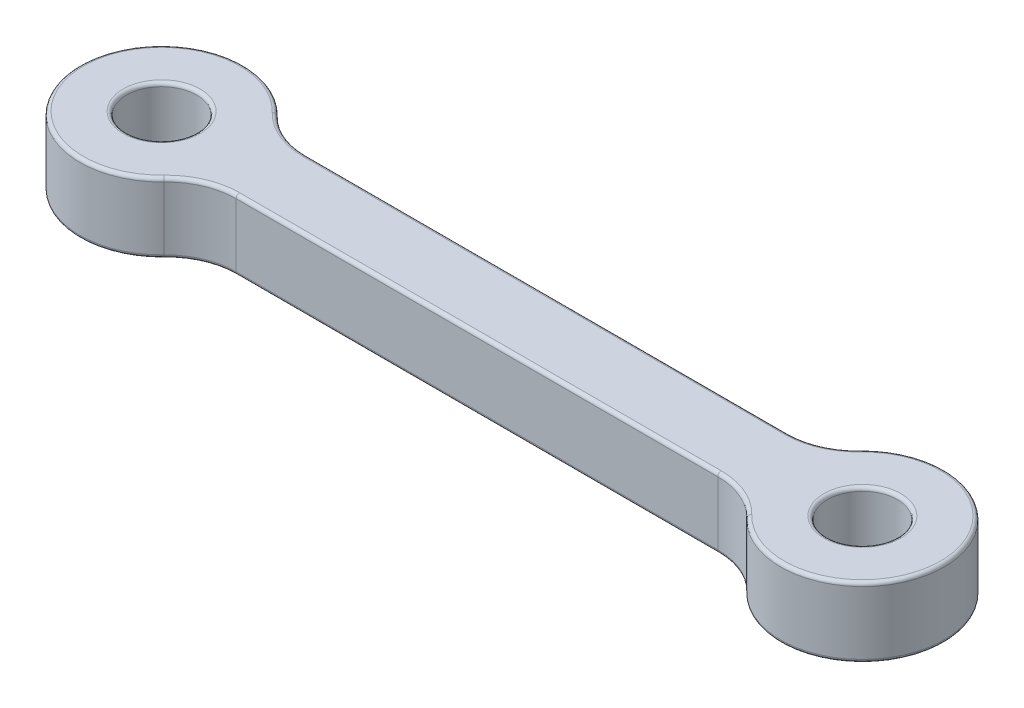
ISO-10303-21;
HEADER;
FILE_DESCRIPTION(('STEP AP214'),'2;1');
FILE_NAME('part.step','',(''),(''),'','','');
FILE_SCHEMA(('AUTOMOTIVE_DESIGN { 1 0 10303 214 1 1 1 1 }'));
ENDSEC;
DATA;
#1=APPLICATION_CONTEXT('core data for automotive mechanical design processes');
#2=APPLICATION_PROTOCOL_DEFINITION('international standard','automotive_design',2000,#1);
#3=PRODUCT_CONTEXT('',#1,'mechanical');
#4=PRODUCT('Part','Part','',(#3));
#5=PRODUCT_RELATED_PRODUCT_CATEGORY('part','',(#4));
#6=PRODUCT_DEFINITION_FORMATION('','',#4);
#7=PRODUCT_DEFINITION_CONTEXT('part definition',#1,'design');
#8=PRODUCT_DEFINITION('design','',#6,#7);
#9=PRODUCT_DEFINITION_SHAPE('','',#8);
#10=(LENGTH_UNIT() NAMED_UNIT(*) SI_UNIT(.MILLI.,.METRE.));
#11=(NAMED_UNIT(*) PLANE_ANGLE_UNIT() SI_UNIT($,.RADIAN.));
#12=(NAMED_UNIT(*) SI_UNIT($,.STERADIAN.) SOLID_ANGLE_UNIT());
#13=UNCERTAINTY_MEASURE_WITH_UNIT(LENGTH_MEASURE(1.E-05),#10,'distance_accuracy_value','');
#14=(GEOMETRIC_REPRESENTATION_CONTEXT(3) GLOBAL_UNCERTAINTY_ASSIGNED_CONTEXT((#13)) GLOBAL_UNIT_ASSIGNED_CONTEXT((#10,
#11,#12)) REPRESENTATION_CONTEXT('',''));
#15=CARTESIAN_POINT('',(0.,0.,0.));
#16=DIRECTION('',(0.,0.,1.));
#17=DIRECTION('',(1.,0.,0.));
#18=AXIS2_PLACEMENT_3D('',#15,#16,#17);
#19=CARTESIAN_POINT('',(-15.,3.,0.));
#20=DIRECTION('',(0.,1.,0.));
#21=DIRECTION('',(0.,0.,1.));
#22=AXIS2_PLACEMENT_3D('',#19,#20,#21);
#23=PLANE('',#22);
#24=CARTESIAN_POINT('',(15.,3.,-1.11022302462516E-13));
#25=DIRECTION('',(0.,1.,0.));
#26=DIRECTION('',(0.,0.,1.));
#27=AXIS2_PLACEMENT_3D('',#24,#25,#26);
#28=CIRCLE('',#27,1.65);
#29=CARTESIAN_POINT('',(15.,3.,1.64999999999989));
#30=VERTEX_POINT('',#29);
#31=EDGE_CURVE('E290',#30,#30,#28,.F.);
#32=ORIENTED_EDGE('',*,*,#31,.T.);
#33=EDGE_LOOP('',(#32));
#34=FACE_BOUND('',#33,.T.);
#35=CARTESIAN_POINT('',(15.,3.,-1.11022302462516E-13));
#36=DIRECTION('',(0.,1.,0.));
#37=DIRECTION('',(0.,0.,1.));
#38=AXIS2_PLACEMENT_3D('',#35,#36,#37);
#39=CIRCLE('',#38,3.35);
#40=CARTESIAN_POINT('',(12.5826318776295,3.,2.31923076923069));
#41=VERTEX_POINT('',#40);
#42=CARTESIAN_POINT('',(12.5826318776294,3.,-2.31923076923085));
#43=VERTEX_POINT('',#42);
#44=EDGE_CURVE('E57',#41,#43,#39,.T.);
#45=ORIENTED_EDGE('',*,*,#44,.T.);
#46=CARTESIAN_POINT('',(10.3095842401765,3.,-4.50000000000005));
#47=DIRECTION('',(0.,1.,0.));
#48=DIRECTION('',(0.,0.,1.));
#49=AXIS2_PLACEMENT_3D('',#46,#47,#48);
#50=CIRCLE('',#49,3.15);
#51=CARTESIAN_POINT('',(10.3095842401765,3.,-1.35000000000005));
#52=VERTEX_POINT('',#51);
#53=EDGE_CURVE('E287',#43,#52,#50,.F.);
#54=ORIENTED_EDGE('',*,*,#53,.T.);
#55=DIRECTION('',(-1.,0.,0.));
#56=VECTOR('',#55,1.);
#57=CARTESIAN_POINT('',(-10.3095842401766,3.,-1.35));
#58=LINE('',#57,#56);
#59=CARTESIAN_POINT('',(-10.3095842401766,3.,-1.35));
#60=VERTEX_POINT('',#59);
#61=EDGE_CURVE('E268',#52,#60,#58,.T.);
#62=ORIENTED_EDGE('',*,*,#61,.T.);
#63=CARTESIAN_POINT('',(-10.3095842401766,3.,-4.5));
#64=DIRECTION('',(0.,1.,0.));
#65=DIRECTION('',(0.,0.,1.));
#66=AXIS2_PLACEMENT_3D('',#63,#64,#65);
#67=CIRCLE('',#66,3.15);
#68=CARTESIAN_POINT('',(-12.5826318776295,3.,-2.31923076923077));
#69=VERTEX_POINT('',#68);
#70=EDGE_CURVE('E271',#60,#69,#67,.F.);
#71=ORIENTED_EDGE('',*,*,#70,.T.);
#72=CARTESIAN_POINT('',(-15.,3.,0.));
#73=DIRECTION('',(0.,1.,0.));
#74=DIRECTION('',(0.,0.,1.));
#75=AXIS2_PLACEMENT_3D('',#72,#73,#74);
#76=CIRCLE('',#75,3.35);
#77=CARTESIAN_POINT('',(-12.5826318776295,3.,2.31923076923077));
#78=VERTEX_POINT('',#77);
#79=EDGE_CURVE('E274',#69,#78,#76,.T.);
#80=ORIENTED_EDGE('',*,*,#79,.T.);
#81=CARTESIAN_POINT('',(-10.3095842401766,3.,4.5));
#82=DIRECTION('',(0.,1.,0.));
#83=DIRECTION('',(0.,0.,1.));
#84=AXIS2_PLACEMENT_3D('',#81,#82,#83);
#85=CIRCLE('',#84,3.15);
#86=CARTESIAN_POINT('',(-10.3095842401766,3.,1.35));
#87=VERTEX_POINT('',#86);
#88=EDGE_CURVE('E277',#78,#87,#85,.F.);
#89=ORIENTED_EDGE('',*,*,#88,.T.);
#90=DIRECTION('',(1.,0.,0.));
#91=VECTOR('',#90,1.);
#92=CARTESIAN_POINT('',(10.3095842401766,3.,1.34999999999995));
#93=LINE('',#92,#91);
#94=CARTESIAN_POINT('',(10.3095842401766,3.,1.34999999999995));
#95=VERTEX_POINT('',#94);
#96=EDGE_CURVE('E280',#87,#95,#93,.T.);
#97=ORIENTED_EDGE('',*,*,#96,.T.);
#98=CARTESIAN_POINT('',(10.3095842401766,3.,4.49999999999995));
#99=DIRECTION('',(0.,1.,0.));
#100=DIRECTION('',(0.,0.,1.));
#101=AXIS2_PLACEMENT_3D('',#98,#99,#100);
#102=CIRCLE('',#101,3.15);
#103=EDGE_CURVE('E62',#95,#41,#102,.F.);
#104=ORIENTED_EDGE('',*,*,#103,.T.);
#105=EDGE_LOOP('',(#45,#54,#62,#71,#80,#89,#97,#104));
#106=FACE_BOUND('',#105,.T.);
#107=CARTESIAN_POINT('',(-15.,3.,0.));
#108=DIRECTION('',(0.,1.,0.));
#109=DIRECTION('',(0.,0.,1.));
#110=AXIS2_PLACEMENT_3D('',#107,#108,#109);
#111=CIRCLE('',#110,1.65);
#112=CARTESIAN_POINT('',(-15.,3.,1.65));
#113=VERTEX_POINT('',#112);
#114=EDGE_CURVE('E264',#113,#113,#111,.F.);
#115=ORIENTED_EDGE('',*,*,#114,.T.);
#116=EDGE_LOOP('',(#115));
#117=FACE_BOUND('',#116,.T.);
#118=ADVANCED_FACE('F39',(#34,#106,#117),#23,.T.);
#119=CARTESIAN_POINT('',(-15.,0.,0.));
#120=DIRECTION('',(0.,1.,0.));
#121=DIRECTION('',(0.,0.,1.));
#122=AXIS2_PLACEMENT_3D('',#119,#120,#121);
#123=PLANE('',#122);
#124=CARTESIAN_POINT('',(15.,0.,-1.11022302462516E-13));
#125=DIRECTION('',(0.,1.,0.));
#126=DIRECTION('',(0.,0.,1.));
#127=AXIS2_PLACEMENT_3D('',#124,#125,#126);
#128=CIRCLE('',#127,1.65);
#129=CARTESIAN_POINT('',(15.,0.,1.64999999999989));
#130=VERTEX_POINT('',#129);
#131=EDGE_CURVE('E209',#130,#130,#128,.T.);
#132=ORIENTED_EDGE('',*,*,#131,.T.);
#133=EDGE_LOOP('',(#132));
#134=FACE_BOUND('',#133,.T.);
#135=DIRECTION('',(1.,0.,0.));
#136=VECTOR('',#135,1.);
#137=CARTESIAN_POINT('',(-15.,0.,1.35000000000001));
#138=LINE('',#137,#136);
#139=CARTESIAN_POINT('',(10.3095842401766,0.,1.34999999999995));
#140=VERTEX_POINT('',#139);
#141=CARTESIAN_POINT('',(-10.3095842401766,0.,1.35));
#142=VERTEX_POINT('',#141);
#143=EDGE_CURVE('E160',#140,#142,#138,.F.);
#144=ORIENTED_EDGE('',*,*,#143,.T.);
#145=CARTESIAN_POINT('',(-10.3095842401766,0.,4.5));
#146=DIRECTION('',(0.,1.,0.));
#147=DIRECTION('',(0.,0.,1.));
#148=AXIS2_PLACEMENT_3D('',#145,#146,#147);
#149=CIRCLE('',#148,3.15);
#150=CARTESIAN_POINT('',(-12.5826318776295,0.,2.31923076923077));
#151=VERTEX_POINT('',#150);
#152=EDGE_CURVE('E206',#142,#151,#149,.T.);
#153=ORIENTED_EDGE('',*,*,#152,.T.);
#154=CARTESIAN_POINT('',(-15.,0.,0.));
#155=DIRECTION('',(0.,1.,0.));
#156=DIRECTION('',(0.,0.,1.));
#157=AXIS2_PLACEMENT_3D('',#154,#155,#156);
#158=CIRCLE('',#157,3.35);
#159=CARTESIAN_POINT('',(-12.5826318776295,0.,-2.31923076923077));
#160=VERTEX_POINT('',#159);
#161=EDGE_CURVE('E203',#151,#160,#158,.F.);
#162=ORIENTED_EDGE('',*,*,#161,.T.);
#163=CARTESIAN_POINT('',(-10.3095842401766,0.,-4.5));
#164=DIRECTION('',(0.,1.,0.));
#165=DIRECTION('',(0.,0.,1.));
#166=AXIS2_PLACEMENT_3D('',#163,#164,#165);
#167=CIRCLE('',#166,3.15);
#168=CARTESIAN_POINT('',(-10.3095842401766,0.,-1.35));
#169=VERTEX_POINT('',#168);
#170=EDGE_CURVE('E200',#160,#169,#167,.T.);
#171=ORIENTED_EDGE('',*,*,#170,.T.);
#172=DIRECTION('',(-1.,0.,0.));
#173=VECTOR('',#172,1.);
#174=CARTESIAN_POINT('',(-15.,0.,-1.34999999999999));
#175=LINE('',#174,#173);
#176=CARTESIAN_POINT('',(10.3095842401765,0.,-1.35000000000005));
#177=VERTEX_POINT('',#176);
#178=EDGE_CURVE('E197',#169,#177,#175,.F.);
#179=ORIENTED_EDGE('',*,*,#178,.T.);
#180=CARTESIAN_POINT('',(10.3095842401765,0.,-4.50000000000005));
#181=DIRECTION('',(0.,1.,0.));
#182=DIRECTION('',(0.,0.,1.));
#183=AXIS2_PLACEMENT_3D('',#180,#181,#182);
#184=CIRCLE('',#183,3.15);
#185=CARTESIAN_POINT('',(12.5826318776294,0.,-2.31923076923085));
#186=VERTEX_POINT('',#185);
#187=EDGE_CURVE('E194',#177,#186,#184,.T.);
#188=ORIENTED_EDGE('',*,*,#187,.T.);
#189=CARTESIAN_POINT('',(15.,0.,-1.11022302462516E-13));
#190=DIRECTION('',(0.,1.,0.));
#191=DIRECTION('',(0.,0.,1.));
#192=AXIS2_PLACEMENT_3D('',#189,#190,#191);
#193=CIRCLE('',#192,3.35);
#194=CARTESIAN_POINT('',(12.5826318776295,0.,2.31923076923069));
#195=VERTEX_POINT('',#194);
#196=EDGE_CURVE('E163',#186,#195,#193,.F.);
#197=ORIENTED_EDGE('',*,*,#196,.T.);
#198=CARTESIAN_POINT('',(10.3095842401766,0.,4.49999999999995));
#199=DIRECTION('',(0.,1.,0.));
#200=DIRECTION('',(0.,0.,1.));
#201=AXIS2_PLACEMENT_3D('',#198,#199,#200);
#202=CIRCLE('',#201,3.15);
#203=EDGE_CURVE('E154',#195,#140,#202,.T.);
#204=ORIENTED_EDGE('',*,*,#203,.T.);
#205=EDGE_LOOP('',(#144,#153,#162,#171,#179,#188,#197,#204));
#206=FACE_BOUND('',#205,.T.);
#207=CARTESIAN_POINT('',(-15.,0.,0.));
#208=DIRECTION('',(0.,1.,0.));
#209=DIRECTION('',(0.,0.,1.));
#210=AXIS2_PLACEMENT_3D('',#207,#208,#209);
#211=CIRCLE('',#210,1.5);
#212=CARTESIAN_POINT('',(-15.,0.,1.5));
#213=VERTEX_POINT('',#212);
#214=EDGE_CURVE('E321',#213,#213,#211,.T.);
#215=ORIENTED_EDGE('',*,*,#214,.T.);
#216=EDGE_LOOP('',(#215));
#217=FACE_BOUND('',#216,.T.);
#218=ADVANCED_FACE('F156',(#134,#206,#217),#123,.F.);
#219=CARTESIAN_POINT('',(-15.,3.,0.));
#220=DIRECTION('',(0.,-1.,0.));
#221=DIRECTION('',(0.,0.,-1.));
#222=AXIS2_PLACEMENT_3D('',#219,#220,#221);
#223=CYLINDRICAL_SURFACE('',#222,3.5);
#224=DIRECTION('',(0.,-1.,0.));
#225=VECTOR('',#224,1.);
#226=CARTESIAN_POINT('',(-12.4743915139412,3.,-2.42307692307693));
#227=LINE('',#226,#225);
#228=CARTESIAN_POINT('',(-12.4743915139412,2.85,-2.42307692307693));
#229=VERTEX_POINT('',#228);
#230=CARTESIAN_POINT('',(-12.4743915139412,0.15,-2.42307692307693));
#231=VERTEX_POINT('',#230);
#232=EDGE_CURVE('E377',#229,#231,#227,.T.);
#233=ORIENTED_EDGE('',*,*,#232,.T.);
#234=CARTESIAN_POINT('',(-15.,0.15,0.));
#235=DIRECTION('',(0.,1.,0.));
#236=DIRECTION('',(0.,0.,1.));
#237=AXIS2_PLACEMENT_3D('',#234,#235,#236);
#238=CIRCLE('',#237,3.5);
#239=CARTESIAN_POINT('',(-12.4743915139412,0.15,2.42307692307692));
#240=VERTEX_POINT('',#239);
#241=EDGE_CURVE('E223',#231,#240,#238,.T.);
#242=ORIENTED_EDGE('',*,*,#241,.T.);
#243=DIRECTION('',(0.,-1.,0.));
#244=VECTOR('',#243,1.);
#245=CARTESIAN_POINT('',(-12.4743915139412,3.,2.42307692307692));
#246=LINE('',#245,#244);
#247=CARTESIAN_POINT('',(-12.4743915139412,2.85,2.42307692307692));
#248=VERTEX_POINT('',#247);
#249=EDGE_CURVE('E367',#240,#248,#246,.F.);
#250=ORIENTED_EDGE('',*,*,#249,.T.);
#251=CARTESIAN_POINT('',(-15.,2.85,0.));
#252=DIRECTION('',(0.,1.,0.));
#253=DIRECTION('',(0.,0.,1.));
#254=AXIS2_PLACEMENT_3D('',#251,#252,#253);
#255=CIRCLE('',#254,3.5);
#256=EDGE_CURVE('E220',#248,#229,#255,.F.);
#257=ORIENTED_EDGE('',*,*,#256,.T.);
#258=EDGE_LOOP('',(#233,#242,#250,#257));
#259=FACE_BOUND('',#258,.T.);
#260=ADVANCED_FACE('F373',(#259),#223,.T.);
#261=CARTESIAN_POINT('',(-11.8377223398316,3.,1.5));
#262=DIRECTION('',(0.,0.,-1.));
#263=DIRECTION('',(-1.,0.,0.));
#264=AXIS2_PLACEMENT_3D('',#261,#262,#263);
#265=PLANE('',#264);
#266=DIRECTION('',(0.,1.,0.));
#267=VECTOR('',#266,1.);
#268=CARTESIAN_POINT('',(10.3095842401766,3.,1.49999999999995));
#269=LINE('',#268,#267);
#270=CARTESIAN_POINT('',(10.3095842401766,0.15,1.49999999999995));
#271=VERTEX_POINT('',#270);
#272=CARTESIAN_POINT('',(10.3095842401766,2.85,1.49999999999995));
#273=VERTEX_POINT('',#272);
#274=EDGE_CURVE('E382',#271,#273,#269,.T.);
#275=ORIENTED_EDGE('',*,*,#274,.T.);
#276=DIRECTION('',(1.,0.,0.));
#277=VECTOR('',#276,1.);
#278=CARTESIAN_POINT('',(-10.3095842401766,2.85,1.5));
#279=LINE('',#278,#277);
#280=CARTESIAN_POINT('',(-10.3095842401766,2.85,1.5));
#281=VERTEX_POINT('',#280);
#282=EDGE_CURVE('E49',#273,#281,#279,.F.);
#283=ORIENTED_EDGE('',*,*,#282,.T.);
#284=DIRECTION('',(0.,1.,0.));
#285=VECTOR('',#284,1.);
#286=CARTESIAN_POINT('',(-10.3095842401766,0.,1.5));
#287=LINE('',#286,#285);
#288=CARTESIAN_POINT('',(-10.3095842401766,0.15,1.5));
#289=VERTEX_POINT('',#288);
#290=EDGE_CURVE('E370',#281,#289,#287,.F.);
#291=ORIENTED_EDGE('',*,*,#290,.T.);
#292=DIRECTION('',(1.,0.,0.));
#293=VECTOR('',#292,1.);
#294=CARTESIAN_POINT('',(-11.8377223398316,0.15,1.5));
#295=LINE('',#294,#293);
#296=EDGE_CURVE('E294',#289,#271,#295,.T.);
#297=ORIENTED_EDGE('',*,*,#296,.T.);
#298=EDGE_LOOP('',(#275,#283,#291,#297));
#299=FACE_BOUND('',#298,.T.);
#300=ADVANCED_FACE('F429',(#299),#265,.F.);
#301=CARTESIAN_POINT('',(15.,3.,-1.11022302462516E-13));
#302=DIRECTION('',(0.,-1.,0.));
#303=DIRECTION('',(0.,0.,-1.));
#304=AXIS2_PLACEMENT_3D('',#301,#302,#303);
#305=CYLINDRICAL_SURFACE('',#304,3.5);
#306=DIRECTION('',(0.,-1.,0.));
#307=VECTOR('',#306,1.);
#308=CARTESIAN_POINT('',(12.4743915139413,3.,2.42307692307684));
#309=LINE('',#308,#307);
#310=CARTESIAN_POINT('',(12.4743915139413,2.85,2.42307692307684));
#311=VERTEX_POINT('',#310);
#312=CARTESIAN_POINT('',(12.4743915139413,0.15,2.42307692307684));
#313=VERTEX_POINT('',#312);
#314=EDGE_CURVE('E390',#311,#313,#309,.T.);
#315=ORIENTED_EDGE('',*,*,#314,.T.);
#316=CARTESIAN_POINT('',(15.,0.15,-1.11022302462516E-13));
#317=DIRECTION('',(0.,1.,0.));
#318=DIRECTION('',(0.,0.,1.));
#319=AXIS2_PLACEMENT_3D('',#316,#317,#318);
#320=CIRCLE('',#319,3.5);
#321=CARTESIAN_POINT('',(12.4743915139412,0.15,-2.423076923077));
#322=VERTEX_POINT('',#321);
#323=EDGE_CURVE('E248',#313,#322,#320,.T.);
#324=ORIENTED_EDGE('',*,*,#323,.T.);
#325=DIRECTION('',(0.,-1.,0.));
#326=VECTOR('',#325,1.);
#327=CARTESIAN_POINT('',(12.4743915139412,3.,-2.423076923077));
#328=LINE('',#327,#326);
#329=CARTESIAN_POINT('',(12.4743915139412,2.85,-2.423076923077));
#330=VERTEX_POINT('',#329);
#331=EDGE_CURVE('E394',#322,#330,#328,.F.);
#332=ORIENTED_EDGE('',*,*,#331,.T.);
#333=CARTESIAN_POINT('',(15.,2.85,-1.11022302462516E-13));
#334=DIRECTION('',(0.,1.,0.));
#335=DIRECTION('',(0.,0.,1.));
#336=AXIS2_PLACEMENT_3D('',#333,#334,#335);
#337=CIRCLE('',#336,3.5);
#338=EDGE_CURVE('E245',#330,#311,#337,.F.);
#339=ORIENTED_EDGE('',*,*,#338,.T.);
#340=EDGE_LOOP('',(#315,#324,#332,#339));
#341=FACE_BOUND('',#340,.T.);
#342=ADVANCED_FACE('F415',(#341),#305,.T.);
#343=CARTESIAN_POINT('',(-11.8377223398316,3.,-1.5));
#344=DIRECTION('',(0.,0.,1.));
#345=DIRECTION('',(1.,0.,0.));
#346=AXIS2_PLACEMENT_3D('',#343,#344,#345);
#347=PLANE('',#346);
#348=DIRECTION('',(0.,1.,0.));
#349=VECTOR('',#348,1.);
#350=CARTESIAN_POINT('',(10.3095842401765,0.,-1.50000000000005));
#351=LINE('',#350,#349);
#352=CARTESIAN_POINT('',(10.3095842401765,2.85,-1.50000000000005));
#353=VERTEX_POINT('',#352);
#354=CARTESIAN_POINT('',(10.3095842401765,0.15,-1.50000000000005));
#355=VERTEX_POINT('',#354);
#356=EDGE_CURVE('E188',#353,#355,#351,.F.);
#357=ORIENTED_EDGE('',*,*,#356,.T.);
#358=DIRECTION('',(-1.,0.,0.));
#359=VECTOR('',#358,1.);
#360=CARTESIAN_POINT('',(-11.8377223398316,0.15,-1.5));
#361=LINE('',#360,#359);
#362=CARTESIAN_POINT('',(-10.3095842401766,0.15,-1.5));
#363=VERTEX_POINT('',#362);
#364=EDGE_CURVE('E235',#355,#363,#361,.T.);
#365=ORIENTED_EDGE('',*,*,#364,.T.);
#366=DIRECTION('',(0.,1.,0.));
#367=VECTOR('',#366,1.);
#368=CARTESIAN_POINT('',(-10.3095842401766,3.,-1.5));
#369=LINE('',#368,#367);
#370=CARTESIAN_POINT('',(-10.3095842401766,2.85,-1.5));
#371=VERTEX_POINT('',#370);
#372=EDGE_CURVE('E184',#363,#371,#369,.T.);
#373=ORIENTED_EDGE('',*,*,#372,.T.);
#374=DIRECTION('',(-1.,0.,0.));
#375=VECTOR('',#374,1.);
#376=CARTESIAN_POINT('',(10.3095842401765,2.85,-1.50000000000005));
#377=LINE('',#376,#375);
#378=EDGE_CURVE('E232',#371,#353,#377,.F.);
#379=ORIENTED_EDGE('',*,*,#378,.T.);
#380=EDGE_LOOP('',(#357,#365,#373,#379));
#381=FACE_BOUND('',#380,.T.);
#382=ADVANCED_FACE('F405',(#381),#347,.F.);
#383=CARTESIAN_POINT('',(-15.,3.,0.));
#384=DIRECTION('',(0.,-1.,0.));
#385=DIRECTION('',(0.,0.,-1.));
#386=AXIS2_PLACEMENT_3D('',#383,#384,#385);
#387=CYLINDRICAL_SURFACE('',#386,1.5);
#388=CARTESIAN_POINT('',(-15.,2.85,0.));
#389=DIRECTION('',(0.,1.,0.));
#390=DIRECTION('',(0.,0.,1.));
#391=AXIS2_PLACEMENT_3D('',#388,#389,#390);
#392=CIRCLE('',#391,1.5);
#393=CARTESIAN_POINT('',(-15.,2.85,1.5));
#394=VERTEX_POINT('',#393);
#395=EDGE_CURVE('E11',#394,#394,#392,.T.);
#396=ORIENTED_EDGE('',*,*,#395,.T.);
#397=EDGE_LOOP('',(#396));
#398=FACE_BOUND('',#397,.T.);
#399=ORIENTED_EDGE('',*,*,#214,.F.);
#400=EDGE_LOOP('',(#399));
#401=FACE_BOUND('',#400,.T.);
#402=ADVANCED_FACE('F402',(#398,#401),#387,.F.);
#403=CARTESIAN_POINT('',(15.,3.,-1.11022302462516E-13));
#404=DIRECTION('',(0.,-1.,0.));
#405=DIRECTION('',(0.,0.,-1.));
#406=AXIS2_PLACEMENT_3D('',#403,#404,#405);
#407=CYLINDRICAL_SURFACE('',#406,1.5);
#408=CARTESIAN_POINT('',(15.,2.85,-1.11022302462516E-13));
#409=DIRECTION('',(0.,1.,0.));
#410=DIRECTION('',(0.,0.,1.));
#411=AXIS2_PLACEMENT_3D('',#408,#409,#410);
#412=CIRCLE('',#411,1.5);
#413=CARTESIAN_POINT('',(15.,2.85,1.49999999999989));
#414=VERTEX_POINT('',#413);
#415=EDGE_CURVE('E260',#414,#414,#412,.T.);
#416=ORIENTED_EDGE('',*,*,#415,.T.);
#417=EDGE_LOOP('',(#416));
#418=FACE_BOUND('',#417,.T.);
#419=CARTESIAN_POINT('',(15.,0.15,-1.11022302462516E-13));
#420=DIRECTION('',(0.,1.,0.));
#421=DIRECTION('',(0.,0.,1.));
#422=AXIS2_PLACEMENT_3D('',#419,#420,#421);
#423=CIRCLE('',#422,1.5);
#424=CARTESIAN_POINT('',(15.,0.15,1.49999999999989));
#425=VERTEX_POINT('',#424);
#426=EDGE_CURVE('E256',#425,#425,#423,.F.);
#427=ORIENTED_EDGE('',*,*,#426,.T.);
#428=EDGE_LOOP('',(#427));
#429=FACE_BOUND('',#428,.T.);
#430=ADVANCED_FACE('F404',(#418,#429),#407,.F.);
#431=CARTESIAN_POINT('',(10.3095842401766,3.,4.49999999999995));
#432=DIRECTION('',(0.,-1.,0.));
#433=DIRECTION('',(0.,0.,-1.));
#434=AXIS2_PLACEMENT_3D('',#431,#432,#433);
#435=CYLINDRICAL_SURFACE('',#434,3.);
#436=ORIENTED_EDGE('',*,*,#274,.F.);
#437=CARTESIAN_POINT('',(10.3095842401766,0.15,4.49999999999995));
#438=DIRECTION('',(0.,1.,0.));
#439=DIRECTION('',(0.,0.,1.));
#440=AXIS2_PLACEMENT_3D('',#437,#438,#439);
#441=CIRCLE('',#440,3.);
#442=EDGE_CURVE('E173',#271,#313,#441,.F.);
#443=ORIENTED_EDGE('',*,*,#442,.T.);
#444=ORIENTED_EDGE('',*,*,#314,.F.);
#445=CARTESIAN_POINT('',(10.3095842401766,2.85,4.49999999999995));
#446=DIRECTION('',(0.,1.,0.));
#447=DIRECTION('',(0.,0.,1.));
#448=AXIS2_PLACEMENT_3D('',#445,#446,#447);
#449=CIRCLE('',#448,3.);
#450=EDGE_CURVE('E251',#311,#273,#449,.T.);
#451=ORIENTED_EDGE('',*,*,#450,.T.);
#452=EDGE_LOOP('',(#436,#443,#444,#451));
#453=FACE_BOUND('',#452,.T.);
#454=ADVANCED_FACE('F412',(#453),#435,.F.);
#455=CARTESIAN_POINT('',(-10.3095842401766,3.,4.5));
#456=DIRECTION('',(0.,-1.,0.));
#457=DIRECTION('',(0.,0.,-1.));
#458=AXIS2_PLACEMENT_3D('',#455,#456,#457);
#459=CYLINDRICAL_SURFACE('',#458,3.);
#460=ORIENTED_EDGE('',*,*,#249,.F.);
#461=CARTESIAN_POINT('',(-10.3095842401766,0.15,4.5));
#462=DIRECTION('',(0.,1.,0.));
#463=DIRECTION('',(0.,0.,1.));
#464=AXIS2_PLACEMENT_3D('',#461,#462,#463);
#465=CIRCLE('',#464,3.);
#466=EDGE_CURVE('E216',#240,#289,#465,.F.);
#467=ORIENTED_EDGE('',*,*,#466,.T.);
#468=ORIENTED_EDGE('',*,*,#290,.F.);
#469=CARTESIAN_POINT('',(-10.3095842401766,2.85,4.5));
#470=DIRECTION('',(0.,1.,0.));
#471=DIRECTION('',(0.,0.,1.));
#472=AXIS2_PLACEMENT_3D('',#469,#470,#471);
#473=CIRCLE('',#472,3.);
#474=EDGE_CURVE('E213',#281,#248,#473,.T.);
#475=ORIENTED_EDGE('',*,*,#474,.T.);
#476=EDGE_LOOP('',(#460,#467,#468,#475));
#477=FACE_BOUND('',#476,.T.);
#478=ADVANCED_FACE('F366',(#477),#459,.F.);
#479=CARTESIAN_POINT('',(-10.3095842401766,3.,-4.5));
#480=DIRECTION('',(0.,-1.,0.));
#481=DIRECTION('',(0.,0.,-1.));
#482=AXIS2_PLACEMENT_3D('',#479,#480,#481);
#483=CYLINDRICAL_SURFACE('',#482,3.);
#484=ORIENTED_EDGE('',*,*,#372,.F.);
#485=CARTESIAN_POINT('',(-10.3095842401766,0.15,-4.5));
#486=DIRECTION('',(0.,1.,0.));
#487=DIRECTION('',(0.,0.,1.));
#488=AXIS2_PLACEMENT_3D('',#485,#486,#487);
#489=CIRCLE('',#488,3.);
#490=EDGE_CURVE('E229',#363,#231,#489,.F.);
#491=ORIENTED_EDGE('',*,*,#490,.T.);
#492=ORIENTED_EDGE('',*,*,#232,.F.);
#493=CARTESIAN_POINT('',(-10.3095842401766,2.85,-4.5));
#494=DIRECTION('',(0.,1.,0.));
#495=DIRECTION('',(0.,0.,1.));
#496=AXIS2_PLACEMENT_3D('',#493,#494,#495);
#497=CIRCLE('',#496,3.);
#498=EDGE_CURVE('E226',#229,#371,#497,.T.);
#499=ORIENTED_EDGE('',*,*,#498,.T.);
#500=EDGE_LOOP('',(#484,#491,#492,#499));
#501=FACE_BOUND('',#500,.T.);
#502=ADVANCED_FACE('F441',(#501),#483,.F.);
#503=CARTESIAN_POINT('',(10.3095842401765,3.,-4.50000000000005));
#504=DIRECTION('',(0.,-1.,0.));
#505=DIRECTION('',(0.,0.,-1.));
#506=AXIS2_PLACEMENT_3D('',#503,#504,#505);
#507=CYLINDRICAL_SURFACE('',#506,3.);
#508=ORIENTED_EDGE('',*,*,#331,.F.);
#509=CARTESIAN_POINT('',(10.3095842401765,0.15,-4.50000000000005));
#510=DIRECTION('',(0.,1.,0.));
#511=DIRECTION('',(0.,0.,1.));
#512=AXIS2_PLACEMENT_3D('',#509,#510,#511);
#513=CIRCLE('',#512,3.);
#514=EDGE_CURVE('E242',#322,#355,#513,.F.);
#515=ORIENTED_EDGE('',*,*,#514,.T.);
#516=ORIENTED_EDGE('',*,*,#356,.F.);
#517=CARTESIAN_POINT('',(10.3095842401765,2.85,-4.50000000000005));
#518=DIRECTION('',(0.,1.,0.));
#519=DIRECTION('',(0.,0.,1.));
#520=AXIS2_PLACEMENT_3D('',#517,#518,#519);
#521=CIRCLE('',#520,3.);
#522=EDGE_CURVE('E238',#353,#330,#521,.T.);
#523=ORIENTED_EDGE('',*,*,#522,.T.);
#524=EDGE_LOOP('',(#508,#515,#516,#523));
#525=FACE_BOUND('',#524,.T.);
#526=ADVANCED_FACE('F444',(#525),#507,.F.);
#527=CARTESIAN_POINT('',(10.3095842401765,0.15,-4.50000000000005));
#528=DIRECTION('',(0.,1.,0.));
#529=DIRECTION('',(0.,0.,1.));
#530=AXIS2_PLACEMENT_3D('',#527,#528,#529);
#531=TOROIDAL_SURFACE('',#530,3.15,0.15);
#532=CARTESIAN_POINT('',(10.3095842401765,0.15,-1.35000000000005));
#533=DIRECTION('',(-1.,0.,0.));
#534=DIRECTION('',(0.,0.,1.));
#535=AXIS2_PLACEMENT_3D('',#532,#533,#534);
#536=CIRCLE('',#535,0.15);
#537=EDGE_CURVE('E313',#355,#177,#536,.T.);
#538=ORIENTED_EDGE('',*,*,#537,.F.);
#539=ORIENTED_EDGE('',*,*,#514,.F.);
#540=CARTESIAN_POINT('',(12.5826318776294,0.15,-2.31923076923085));
#541=DIRECTION('',(0.692307692307682,0.,-0.72160242458823));
#542=DIRECTION('',(-0.72160242458823,0.,-0.692307692307682));
#543=AXIS2_PLACEMENT_3D('',#540,#541,#542);
#544=CIRCLE('',#543,0.15);
#545=EDGE_CURVE('E317',#186,#322,#544,.T.);
#546=ORIENTED_EDGE('',*,*,#545,.F.);
#547=ORIENTED_EDGE('',*,*,#187,.F.);
#548=EDGE_LOOP('',(#538,#539,#546,#547));
#549=FACE_BOUND('',#548,.T.);
#550=ADVANCED_FACE('F448',(#549),#531,.T.);
#551=CARTESIAN_POINT('',(15.,0.15,-1.11022302462516E-13));
#552=DIRECTION('',(0.,1.,0.));
#553=DIRECTION('',(0.,0.,1.));
#554=AXIS2_PLACEMENT_3D('',#551,#552,#553);
#555=TOROIDAL_SURFACE('',#554,3.35,0.15);
#556=ORIENTED_EDGE('',*,*,#545,.T.);
#557=ORIENTED_EDGE('',*,*,#323,.F.);
#558=CARTESIAN_POINT('',(12.5826318776295,0.15,2.31923076923069));
#559=DIRECTION('',(-0.692307692307703,0.,-0.72160242458821));
#560=DIRECTION('',(-0.72160242458821,0.,0.692307692307703));
#561=AXIS2_PLACEMENT_3D('',#558,#559,#560);
#562=CIRCLE('',#561,0.15);
#563=EDGE_CURVE('E310',#195,#313,#562,.T.);
#564=ORIENTED_EDGE('',*,*,#563,.F.);
#565=ORIENTED_EDGE('',*,*,#196,.F.);
#566=EDGE_LOOP('',(#556,#557,#564,#565));
#567=FACE_BOUND('',#566,.T.);
#568=ADVANCED_FACE('F470',(#567),#555,.T.);
#569=CARTESIAN_POINT('',(-11.8377223398316,0.15,-1.35));
#570=DIRECTION('',(-1.,0.,0.));
#571=DIRECTION('',(0.,0.,1.));
#572=AXIS2_PLACEMENT_3D('',#569,#570,#571);
#573=CYLINDRICAL_SURFACE('',#572,0.15);
#574=ORIENTED_EDGE('',*,*,#537,.T.);
#575=ORIENTED_EDGE('',*,*,#178,.F.);
#576=CARTESIAN_POINT('',(-10.3095842401766,0.15,-1.35));
#577=DIRECTION('',(-1.,0.,0.));
#578=DIRECTION('',(0.,0.,1.));
#579=AXIS2_PLACEMENT_3D('',#576,#577,#578);
#580=CIRCLE('',#579,0.15);
#581=EDGE_CURVE('E177',#363,#169,#580,.T.);
#582=ORIENTED_EDGE('',*,*,#581,.F.);
#583=ORIENTED_EDGE('',*,*,#364,.F.);
#584=EDGE_LOOP('',(#574,#575,#582,#583));
#585=FACE_BOUND('',#584,.T.);
#586=ADVANCED_FACE('F467',(#585),#573,.T.);
#587=CARTESIAN_POINT('',(10.3095842401766,0.15,4.49999999999995));
#588=DIRECTION('',(0.,1.,0.));
#589=DIRECTION('',(0.,0.,1.));
#590=AXIS2_PLACEMENT_3D('',#587,#588,#589);
#591=TOROIDAL_SURFACE('',#590,3.15,0.15);
#592=ORIENTED_EDGE('',*,*,#563,.T.);
#593=ORIENTED_EDGE('',*,*,#442,.F.);
#594=CARTESIAN_POINT('',(10.3095842401766,0.15,1.34999999999995));
#595=DIRECTION('',(-1.,0.,0.));
#596=DIRECTION('',(0.,0.,1.));
#597=AXIS2_PLACEMENT_3D('',#594,#595,#596);
#598=CIRCLE('',#597,0.15);
#599=EDGE_CURVE('E171',#140,#271,#598,.T.);
#600=ORIENTED_EDGE('',*,*,#599,.F.);
#601=ORIENTED_EDGE('',*,*,#203,.F.);
#602=EDGE_LOOP('',(#592,#593,#600,#601));
#603=FACE_BOUND('',#602,.T.);
#604=ADVANCED_FACE('F172',(#603),#591,.T.);
#605=CARTESIAN_POINT('',(-10.3095842401766,0.15,-4.5));
#606=DIRECTION('',(0.,1.,0.));
#607=DIRECTION('',(0.,0.,1.));
#608=AXIS2_PLACEMENT_3D('',#605,#606,#607);
#609=TOROIDAL_SURFACE('',#608,3.15,0.15);
#610=ORIENTED_EDGE('',*,*,#581,.T.);
#611=ORIENTED_EDGE('',*,*,#170,.F.);
#612=CARTESIAN_POINT('',(-12.5826318776295,0.15,-2.31923076923077));
#613=DIRECTION('',(-0.692307692307693,0.,-0.72160242458822));
#614=DIRECTION('',(-0.72160242458822,0.,0.692307692307693));
#615=AXIS2_PLACEMENT_3D('',#612,#613,#614);
#616=CIRCLE('',#615,0.15);
#617=EDGE_CURVE('E178',#231,#160,#616,.T.);
#618=ORIENTED_EDGE('',*,*,#617,.F.);
#619=ORIENTED_EDGE('',*,*,#490,.F.);
#620=EDGE_LOOP('',(#610,#611,#618,#619));
#621=FACE_BOUND('',#620,.T.);
#622=ADVANCED_FACE('F461',(#621),#609,.T.);
#623=CARTESIAN_POINT('',(-11.8377223398316,0.15,1.35));
#624=DIRECTION('',(1.,0.,0.));
#625=DIRECTION('',(0.,0.,-1.));
#626=AXIS2_PLACEMENT_3D('',#623,#624,#625);
#627=CYLINDRICAL_SURFACE('',#626,0.15);
#628=ORIENTED_EDGE('',*,*,#599,.T.);
#629=ORIENTED_EDGE('',*,*,#296,.F.);
#630=CARTESIAN_POINT('',(-10.3095842401766,0.15,1.35));
#631=DIRECTION('',(-1.,0.,0.));
#632=DIRECTION('',(0.,0.,1.));
#633=AXIS2_PLACEMENT_3D('',#630,#631,#632);
#634=CIRCLE('',#633,0.15);
#635=EDGE_CURVE('E181',#142,#289,#634,.T.);
#636=ORIENTED_EDGE('',*,*,#635,.F.);
#637=ORIENTED_EDGE('',*,*,#143,.F.);
#638=EDGE_LOOP('',(#628,#629,#636,#637));
#639=FACE_BOUND('',#638,.T.);
#640=ADVANCED_FACE('F180',(#639),#627,.T.);
#641=CARTESIAN_POINT('',(-15.,0.15,0.));
#642=DIRECTION('',(0.,1.,0.));
#643=DIRECTION('',(0.,0.,1.));
#644=AXIS2_PLACEMENT_3D('',#641,#642,#643);
#645=TOROIDAL_SURFACE('',#644,3.35,0.15);
#646=ORIENTED_EDGE('',*,*,#617,.T.);
#647=ORIENTED_EDGE('',*,*,#161,.F.);
#648=CARTESIAN_POINT('',(-12.5826318776295,0.15,2.31923076923077));
#649=DIRECTION('',(0.692307692307691,0.,-0.721602424588221));
#650=DIRECTION('',(-0.721602424588221,0.,-0.692307692307691));
#651=AXIS2_PLACEMENT_3D('',#648,#649,#650);
#652=CIRCLE('',#651,0.15);
#653=EDGE_CURVE('E299',#240,#151,#652,.T.);
#654=ORIENTED_EDGE('',*,*,#653,.F.);
#655=ORIENTED_EDGE('',*,*,#241,.F.);
#656=EDGE_LOOP('',(#646,#647,#654,#655));
#657=FACE_BOUND('',#656,.T.);
#658=ADVANCED_FACE('F454',(#657),#645,.T.);
#659=CARTESIAN_POINT('',(-10.3095842401766,0.15,4.5));
#660=DIRECTION('',(0.,1.,0.));
#661=DIRECTION('',(0.,0.,1.));
#662=AXIS2_PLACEMENT_3D('',#659,#660,#661);
#663=TOROIDAL_SURFACE('',#662,3.15,0.15);
#664=ORIENTED_EDGE('',*,*,#635,.T.);
#665=ORIENTED_EDGE('',*,*,#466,.F.);
#666=ORIENTED_EDGE('',*,*,#653,.T.);
#667=ORIENTED_EDGE('',*,*,#152,.F.);
#668=EDGE_LOOP('',(#664,#665,#666,#667));
#669=FACE_BOUND('',#668,.T.);
#670=ADVANCED_FACE('F450',(#669),#663,.T.);
#671=CARTESIAN_POINT('',(15.,2.85,-1.11022302462516E-13));
#672=DIRECTION('',(0.,1.,0.));
#673=DIRECTION('',(0.,0.,1.));
#674=AXIS2_PLACEMENT_3D('',#671,#672,#673);
#675=TOROIDAL_SURFACE('',#674,1.65,0.15);
#676=ORIENTED_EDGE('',*,*,#31,.F.);
#677=EDGE_LOOP('',(#676));
#678=FACE_BOUND('',#677,.T.);
#679=ORIENTED_EDGE('',*,*,#415,.F.);
#680=EDGE_LOOP('',(#679));
#681=FACE_BOUND('',#680,.T.);
#682=ADVANCED_FACE('F453',(#678,#681),#675,.T.);
#683=CARTESIAN_POINT('',(-10.3095842401766,2.85,4.5));
#684=DIRECTION('',(0.,1.,0.));
#685=DIRECTION('',(0.,0.,1.));
#686=AXIS2_PLACEMENT_3D('',#683,#684,#685);
#687=TOROIDAL_SURFACE('',#686,3.15,0.15);
#688=CARTESIAN_POINT('',(-12.5826318776295,2.85,2.31923076923077));
#689=DIRECTION('',(-0.692307692307691,0.,0.721602424588221));
#690=DIRECTION('',(0.721602424588221,0.,0.692307692307691));
#691=AXIS2_PLACEMENT_3D('',#688,#689,#690);
#692=CIRCLE('',#691,0.15);
#693=EDGE_CURVE('E343',#248,#78,#692,.T.);
#694=ORIENTED_EDGE('',*,*,#693,.F.);
#695=ORIENTED_EDGE('',*,*,#474,.F.);
#696=CARTESIAN_POINT('',(-10.3095842401766,2.85,1.35));
#697=DIRECTION('',(1.,0.,0.));
#698=DIRECTION('',(0.,0.,-1.));
#699=AXIS2_PLACEMENT_3D('',#696,#697,#698);
#700=CIRCLE('',#699,0.15);
#701=EDGE_CURVE('E43',#87,#281,#700,.T.);
#702=ORIENTED_EDGE('',*,*,#701,.F.);
#703=ORIENTED_EDGE('',*,*,#88,.F.);
#704=EDGE_LOOP('',(#694,#695,#702,#703));
#705=FACE_BOUND('',#704,.T.);
#706=ADVANCED_FACE('F361',(#705),#687,.T.);
#707=CARTESIAN_POINT('',(-15.,2.85,1.35000000000001));
#708=DIRECTION('',(-1.,0.,0.));
#709=DIRECTION('',(0.,0.,1.));
#710=AXIS2_PLACEMENT_3D('',#707,#708,#709);
#711=CYLINDRICAL_SURFACE('',#710,0.15);
#712=ORIENTED_EDGE('',*,*,#701,.T.);
#713=ORIENTED_EDGE('',*,*,#282,.F.);
#714=CARTESIAN_POINT('',(10.3095842401766,2.85,1.34999999999995));
#715=DIRECTION('',(1.,0.,0.));
#716=DIRECTION('',(0.,0.,-1.));
#717=AXIS2_PLACEMENT_3D('',#714,#715,#716);
#718=CIRCLE('',#717,0.15);
#719=EDGE_CURVE('E340',#95,#273,#718,.T.);
#720=ORIENTED_EDGE('',*,*,#719,.F.);
#721=ORIENTED_EDGE('',*,*,#96,.F.);
#722=EDGE_LOOP('',(#712,#713,#720,#721));
#723=FACE_BOUND('',#722,.T.);
#724=ADVANCED_FACE('F356',(#723),#711,.T.);
#725=CARTESIAN_POINT('',(-15.,2.85,0.));
#726=DIRECTION('',(0.,1.,0.));
#727=DIRECTION('',(0.,0.,1.));
#728=AXIS2_PLACEMENT_3D('',#725,#726,#727);
#729=TOROIDAL_SURFACE('',#728,3.35,0.15);
#730=ORIENTED_EDGE('',*,*,#693,.T.);
#731=ORIENTED_EDGE('',*,*,#79,.F.);
#732=CARTESIAN_POINT('',(-12.5826318776295,2.85,-2.31923076923077));
#733=DIRECTION('',(0.692307692307693,0.,0.72160242458822));
#734=DIRECTION('',(0.72160242458822,0.,-0.692307692307693));
#735=AXIS2_PLACEMENT_3D('',#732,#733,#734);
#736=CIRCLE('',#735,0.15);
#737=EDGE_CURVE('E336',#229,#69,#736,.T.);
#738=ORIENTED_EDGE('',*,*,#737,.F.);
#739=ORIENTED_EDGE('',*,*,#256,.F.);
#740=EDGE_LOOP('',(#730,#731,#738,#739));
#741=FACE_BOUND('',#740,.T.);
#742=ADVANCED_FACE('F501',(#741),#729,.T.);
#743=CARTESIAN_POINT('',(10.3095842401766,2.85,4.49999999999995));
#744=DIRECTION('',(0.,1.,0.));
#745=DIRECTION('',(0.,0.,1.));
#746=AXIS2_PLACEMENT_3D('',#743,#744,#745);
#747=TOROIDAL_SURFACE('',#746,3.15,0.15);
#748=ORIENTED_EDGE('',*,*,#719,.T.);
#749=ORIENTED_EDGE('',*,*,#450,.F.);
#750=CARTESIAN_POINT('',(12.5826318776295,2.85,2.31923076923069));
#751=DIRECTION('',(0.692307692307704,0.,0.721602424588208));
#752=DIRECTION('',(0.721602424588208,0.,-0.692307692307705));
#753=AXIS2_PLACEMENT_3D('',#750,#751,#752);
#754=CIRCLE('',#753,0.15);
#755=EDGE_CURVE('E332',#41,#311,#754,.T.);
#756=ORIENTED_EDGE('',*,*,#755,.F.);
#757=ORIENTED_EDGE('',*,*,#103,.F.);
#758=EDGE_LOOP('',(#748,#749,#756,#757));
#759=FACE_BOUND('',#758,.T.);
#760=ADVANCED_FACE('F497',(#759),#747,.T.);
#761=CARTESIAN_POINT('',(-10.3095842401766,2.85,-4.5));
#762=DIRECTION('',(0.,1.,0.));
#763=DIRECTION('',(0.,0.,1.));
#764=AXIS2_PLACEMENT_3D('',#761,#762,#763);
#765=TOROIDAL_SURFACE('',#764,3.15,0.15);
#766=ORIENTED_EDGE('',*,*,#737,.T.);
#767=ORIENTED_EDGE('',*,*,#70,.F.);
#768=CARTESIAN_POINT('',(-10.3095842401766,2.85,-1.35));
#769=DIRECTION('',(1.,0.,0.));
#770=DIRECTION('',(0.,0.,-1.));
#771=AXIS2_PLACEMENT_3D('',#768,#769,#770);
#772=CIRCLE('',#771,0.15);
#773=EDGE_CURVE('E328',#371,#60,#772,.T.);
#774=ORIENTED_EDGE('',*,*,#773,.F.);
#775=ORIENTED_EDGE('',*,*,#498,.F.);
#776=EDGE_LOOP('',(#766,#767,#774,#775));
#777=FACE_BOUND('',#776,.T.);
#778=ADVANCED_FACE('F493',(#777),#765,.T.);
#779=CARTESIAN_POINT('',(15.,2.85,-1.11022302462516E-13));
#780=DIRECTION('',(0.,1.,0.));
#781=DIRECTION('',(0.,0.,1.));
#782=AXIS2_PLACEMENT_3D('',#779,#780,#781);
#783=TOROIDAL_SURFACE('',#782,3.35,0.15);
#784=ORIENTED_EDGE('',*,*,#755,.T.);
#785=ORIENTED_EDGE('',*,*,#338,.F.);
#786=CARTESIAN_POINT('',(12.5826318776294,2.85,-2.31923076923085));
#787=DIRECTION('',(-0.692307692307679,0.,0.721602424588232));
#788=DIRECTION('',(0.721602424588232,0.,0.692307692307679));
#789=AXIS2_PLACEMENT_3D('',#786,#787,#788);
#790=CIRCLE('',#789,0.15);
#791=EDGE_CURVE('E325',#43,#330,#790,.T.);
#792=ORIENTED_EDGE('',*,*,#791,.F.);
#793=ORIENTED_EDGE('',*,*,#44,.F.);
#794=EDGE_LOOP('',(#784,#785,#792,#793));
#795=FACE_BOUND('',#794,.T.);
#796=ADVANCED_FACE('F489',(#795),#783,.T.);
#797=CARTESIAN_POINT('',(-15.,2.85,-1.34999999999999));
#798=DIRECTION('',(1.,0.,0.));
#799=DIRECTION('',(0.,0.,-1.));
#800=AXIS2_PLACEMENT_3D('',#797,#798,#799);
#801=CYLINDRICAL_SURFACE('',#800,0.15);
#802=ORIENTED_EDGE('',*,*,#773,.T.);
#803=ORIENTED_EDGE('',*,*,#61,.F.);
#804=CARTESIAN_POINT('',(10.3095842401765,2.85,-1.35000000000005));
#805=DIRECTION('',(1.,0.,0.));
#806=DIRECTION('',(0.,0.,-1.));
#807=AXIS2_PLACEMENT_3D('',#804,#805,#806);
#808=CIRCLE('',#807,0.15);
#809=EDGE_CURVE('E322',#353,#52,#808,.T.);
#810=ORIENTED_EDGE('',*,*,#809,.F.);
#811=ORIENTED_EDGE('',*,*,#378,.F.);
#812=EDGE_LOOP('',(#802,#803,#810,#811));
#813=FACE_BOUND('',#812,.T.);
#814=ADVANCED_FACE('F485',(#813),#801,.T.);
#815=CARTESIAN_POINT('',(10.3095842401765,2.85,-4.50000000000005));
#816=DIRECTION('',(0.,1.,0.));
#817=DIRECTION('',(0.,0.,1.));
#818=AXIS2_PLACEMENT_3D('',#815,#816,#817);
#819=TOROIDAL_SURFACE('',#818,3.15,0.15);
#820=ORIENTED_EDGE('',*,*,#791,.T.);
#821=ORIENTED_EDGE('',*,*,#522,.F.);
#822=ORIENTED_EDGE('',*,*,#809,.T.);
#823=ORIENTED_EDGE('',*,*,#53,.F.);
#824=EDGE_LOOP('',(#820,#821,#822,#823));
#825=FACE_BOUND('',#824,.T.);
#826=ADVANCED_FACE('F481',(#825),#819,.T.);
#827=CARTESIAN_POINT('',(-15.,2.85,0.));
#828=DIRECTION('',(0.,1.,0.));
#829=DIRECTION('',(0.,0.,1.));
#830=AXIS2_PLACEMENT_3D('',#827,#828,#829);
#831=TOROIDAL_SURFACE('',#830,1.65,0.15);
#832=ORIENTED_EDGE('',*,*,#114,.F.);
#833=EDGE_LOOP('',(#832));
#834=FACE_BOUND('',#833,.T.);
#835=ORIENTED_EDGE('',*,*,#395,.F.);
#836=EDGE_LOOP('',(#835));
#837=FACE_BOUND('',#836,.T.);
#838=ADVANCED_FACE('F484',(#834,#837),#831,.T.);
#839=CARTESIAN_POINT('',(15.,0.15,-1.11022302462516E-13));
#840=DIRECTION('',(0.,1.,0.));
#841=DIRECTION('',(0.,0.,1.));
#842=AXIS2_PLACEMENT_3D('',#839,#840,#841);
#843=TOROIDAL_SURFACE('',#842,1.65,0.15);
#844=ORIENTED_EDGE('',*,*,#426,.F.);
#845=EDGE_LOOP('',(#844));
#846=FACE_BOUND('',#845,.T.);
#847=ORIENTED_EDGE('',*,*,#131,.F.);
#848=EDGE_LOOP('',(#847));
#849=FACE_BOUND('',#848,.T.);
#850=ADVANCED_FACE('F41',(#846,#849),#843,.T.);
#851=CLOSED_SHELL('',(#118,#218,#260,#300,#342,#382,#402,#430,#454,#478,#502,#526,#550,#568,
#586,#604,#622,#640,#658,#670,#682,#706,#724,#742,#760,#778,#796,#814,#826,#838,#850));
#852=MANIFOLD_SOLID_BREP('B2',#851);
#853=ADVANCED_BREP_SHAPE_REPRESENTATION('',(#18,#852),#14);
#854=SHAPE_DEFINITION_REPRESENTATION(#9,#853);
ENDSEC;
END-ISO-10303-21;
